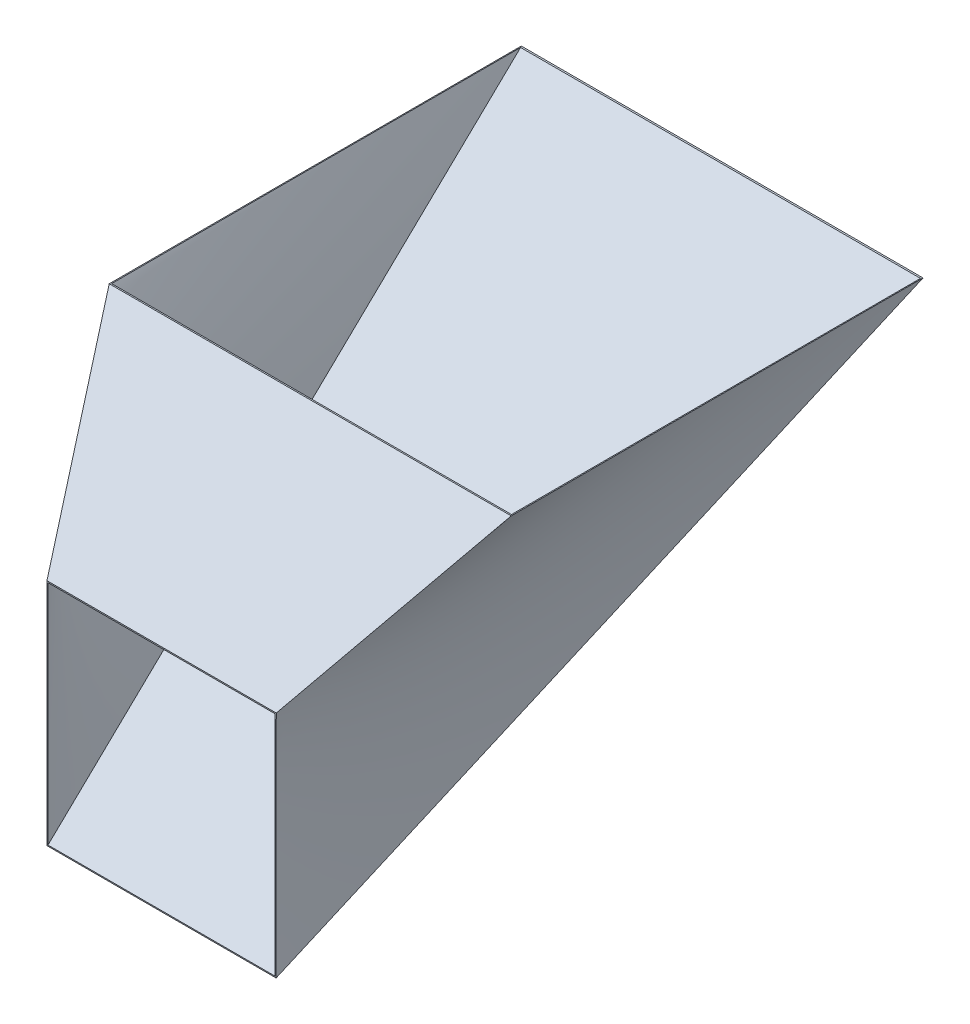
ISO-10303-21;
HEADER;
FILE_DESCRIPTION(('STEP AP214'),'2;1');
FILE_NAME('part.step','',(''),(''),'','','');
FILE_SCHEMA(('AUTOMOTIVE_DESIGN { 1 0 10303 214 1 1 1 1 }'));
ENDSEC;
DATA;
#1=APPLICATION_CONTEXT('core data for automotive mechanical design processes');
#2=APPLICATION_PROTOCOL_DEFINITION('international standard','automotive_design',2000,#1);
#3=PRODUCT_CONTEXT('',#1,'mechanical');
#4=PRODUCT('Part','Part','',(#3));
#5=PRODUCT_RELATED_PRODUCT_CATEGORY('part','',(#4));
#6=PRODUCT_DEFINITION_FORMATION('','',#4);
#7=PRODUCT_DEFINITION_CONTEXT('part definition',#1,'design');
#8=PRODUCT_DEFINITION('design','',#6,#7);
#9=PRODUCT_DEFINITION_SHAPE('','',#8);
#10=(LENGTH_UNIT() NAMED_UNIT(*) SI_UNIT(.MILLI.,.METRE.));
#11=(NAMED_UNIT(*) PLANE_ANGLE_UNIT() SI_UNIT($,.RADIAN.));
#12=(NAMED_UNIT(*) SI_UNIT($,.STERADIAN.) SOLID_ANGLE_UNIT());
#13=UNCERTAINTY_MEASURE_WITH_UNIT(LENGTH_MEASURE(1.E-05),#10,'distance_accuracy_value','');
#14=(GEOMETRIC_REPRESENTATION_CONTEXT(3) GLOBAL_UNCERTAINTY_ASSIGNED_CONTEXT((#13)) GLOBAL_UNIT_ASSIGNED_CONTEXT((#10,
#11,#12)) REPRESENTATION_CONTEXT('',''));
#15=CARTESIAN_POINT('',(0.,0.,0.));
#16=DIRECTION('',(0.,0.,1.));
#17=DIRECTION('',(1.,0.,0.));
#18=AXIS2_PLACEMENT_3D('',#15,#16,#17);
#19=CARTESIAN_POINT('',(0.,0.,0.));
#20=DIRECTION('',(0.,1.,0.));
#21=DIRECTION('',(0.,0.,1.));
#22=AXIS2_PLACEMENT_3D('',#19,#20,#21);
#23=PLANE('',#22);
#24=DIRECTION('',(0.,0.,-1.));
#25=VECTOR('',#24,1.);
#26=CARTESIAN_POINT('',(220.,0.,-225.));
#27=LINE('',#26,#25);
#28=CARTESIAN_POINT('',(220.,0.,225.));
#29=VERTEX_POINT('',#28);
#30=CARTESIAN_POINT('',(220.,0.,-225.));
#31=VERTEX_POINT('',#30);
#32=EDGE_CURVE('E133',#29,#31,#27,.T.);
#33=ORIENTED_EDGE('',*,*,#32,.F.);
#34=DIRECTION('',(1.,0.,0.));
#35=VECTOR('',#34,1.);
#36=CARTESIAN_POINT('',(-220.,0.,225.));
#37=LINE('',#36,#35);
#38=CARTESIAN_POINT('',(-220.,0.,225.));
#39=VERTEX_POINT('',#38);
#40=EDGE_CURVE('E159',#39,#29,#37,.T.);
#41=ORIENTED_EDGE('',*,*,#40,.F.);
#42=DIRECTION('',(0.,0.,1.));
#43=VECTOR('',#42,1.);
#44=CARTESIAN_POINT('',(-220.,0.,-225.));
#45=LINE('',#44,#43);
#46=CARTESIAN_POINT('',(-220.,0.,-225.));
#47=VERTEX_POINT('',#46);
#48=EDGE_CURVE('E145',#47,#39,#45,.T.);
#49=ORIENTED_EDGE('',*,*,#48,.F.);
#50=DIRECTION('',(-1.,0.,0.));
#51=VECTOR('',#50,1.);
#52=CARTESIAN_POINT('',(-220.,0.,-225.));
#53=LINE('',#52,#51);
#54=EDGE_CURVE('E155',#31,#47,#53,.T.);
#55=ORIENTED_EDGE('',*,*,#54,.F.);
#56=EDGE_LOOP('',(#33,#41,#49,#55));
#57=FACE_BOUND('',#56,.T.);
#58=CARTESIAN_POINT('',(221.175220665333,0.,226.460545990022));
#59=CARTESIAN_POINT('',(221.165519850105,0.,218.145964198324));
#60=CARTESIAN_POINT('',(221.156939692717,0.,209.831381216536));
#61=CARTESIAN_POINT('',(221.141545897358,0.,193.202213742846));
#62=CARTESIAN_POINT('',(221.134732259357,0.,184.887629250944));
#63=CARTESIAN_POINT('',(221.12239670645,0.,168.258459663972));
#64=CARTESIAN_POINT('',(221.116874791495,0.,159.943874568903));
#65=CARTESIAN_POINT('',(221.106828687238,0.,143.314703741531));
#66=CARTESIAN_POINT('',(221.102304497941,0.,135.000118009228));
#67=CARTESIAN_POINT('',(221.089876508193,0.,110.056361146522));
#68=CARTESIAN_POINT('',(221.083117285272,0.,93.4271894532348));
#69=CARTESIAN_POINT('',(221.071498520779,0.,60.1688452775092));
#70=CARTESIAN_POINT('',(221.066638979227,0.,43.5396727950706));
#71=CARTESIAN_POINT('',(221.059722848361,0.,16.3384707536719));
#72=CARTESIAN_POINT('',(221.057290036794,0.,5.76644128771332));
#73=CARTESIAN_POINT('',(221.052827135619,0.,-15.3776176912375));
#74=CARTESIAN_POINT('',(221.050797046009,0.,-25.9496472042298));
#75=CARTESIAN_POINT('',(221.045180429828,0.,-57.6657360915291));
#76=CARTESIAN_POINT('',(221.042067555968,0.,-78.8097955490056));
#77=CARTESIAN_POINT('',(221.036653963626,0.,-121.097914798088));
#78=CARTESIAN_POINT('',(221.034353245154,0.,-142.241974589693));
#79=CARTESIAN_POINT('',(221.030324448454,0.,-184.530093916415));
#80=CARTESIAN_POINT('',(221.028596370217,0.,-205.674153451531));
#81=CARTESIAN_POINT('',(221.027034854479,0.,-226.818212993872));
#82=B_SPLINE_CURVE_WITH_KNOTS('',3,(#58,#59,#60,#61,#62,#63,#64,#65,#66,#67,#68,#69,#70,#71,#72,
#73,#74,#75,#76,#77,#78,#79,#80,#81),.UNSPECIFIED.,.F.,.F.,(4,2,2,2,2,2,2,2,2,2,2,4),(0.,
24.9437621087512,49.8875237915527,74.8312845118024,99.7750453549201,149.662564349903,
199.550083870565,231.266173099604,262.982262217359,326.414441248327,389.846620991211,
453.278799797717),.UNSPECIFIED.);
#83=CARTESIAN_POINT('',(221.175220665333,0.,226.460545990022));
#84=VERTEX_POINT('',#83);
#85=CARTESIAN_POINT('',(221.027034854479,0.,-226.818212993872));
#86=VERTEX_POINT('',#85);
#87=EDGE_CURVE('E307',#84,#86,#82,.T.);
#88=ORIENTED_EDGE('',*,*,#87,.T.);
#89=DIRECTION('',(-1.,0.,0.));
#90=VECTOR('',#89,1.);
#91=CARTESIAN_POINT('',(0.,0.,-226.818212993872));
#92=LINE('',#91,#90);
#93=CARTESIAN_POINT('',(-221.027034854479,0.,-226.818212993872));
#94=VERTEX_POINT('',#93);
#95=EDGE_CURVE('E12',#86,#94,#92,.T.);
#96=ORIENTED_EDGE('',*,*,#95,.T.);
#97=CARTESIAN_POINT('',(-221.027034854479,0.,-226.818212993872));
#98=CARTESIAN_POINT('',(-221.028240846582,0.,-210.389438541998));
#99=CARTESIAN_POINT('',(-221.029555819118,0.,-193.960664096186));
#100=CARTESIAN_POINT('',(-221.032502368467,0.,-161.103115224358));
#101=CARTESIAN_POINT('',(-221.03413394528,0.,-144.674340798344));
#102=CARTESIAN_POINT('',(-221.037812346687,0.,-111.816791182955));
#103=CARTESIAN_POINT('',(-221.039859171301,0.,-95.3880159935802));
#104=CARTESIAN_POINT('',(-221.044524299747,0.,-62.5304656937369));
#105=CARTESIAN_POINT('',(-221.047142603579,0.,-46.1016905832682));
#106=CARTESIAN_POINT('',(-221.054080403817,0.,-8.3284588431294));
#107=CARTESIAN_POINT('',(-221.058674506377,0.,13.0159977372503));
#108=CARTESIAN_POINT('',(-221.070024072017,0.,55.704909873736));
#109=CARTESIAN_POINT('',(-221.076779535045,0.,77.0493654298421));
#110=CARTESIAN_POINT('',(-221.089771075777,0.,109.066049088818));
#111=CARTESIAN_POINT('',(-221.094577980813,0.,119.738277759006));
#112=CARTESIAN_POINT('',(-221.105508470598,0.,141.082734360696));
#113=CARTESIAN_POINT('',(-221.111632055337,0.,151.754962292198));
#114=CARTESIAN_POINT('',(-221.125702708779,0.,173.099417519189));
#115=CARTESIAN_POINT('',(-221.13364977757,0.,183.771644814678));
#116=CARTESIAN_POINT('',(-221.147537165977,0.,199.779984193446));
#117=CARTESIAN_POINT('',(-221.152494093056,0.,205.11609712402));
#118=CARTESIAN_POINT('',(-221.163214612592,0.,215.7883222103));
#119=CARTESIAN_POINT('',(-221.168978205056,0.,221.124434366006));
#120=CARTESIAN_POINT('',(-221.175220665332,0.,226.460545990022));
#121=B_SPLINE_CURVE_WITH_KNOTS('',3,(#97,#98,#99,#100,#101,#102,#103,#104,#105,#106,#107,#108,
#109,#110,#111,#112,#113,#114,#115,#116,#117,#118,#119,#120),.UNSPECIFIED.,.F.,.F.,(4,2,2,2,2,2,
2,2,2,2,2,4),(0.,49.2863234909943,98.5726470087193,147.858972952417,197.145298895696,
261.178670073862,325.212039715283,357.228728914357,389.245417881581,421.262108389765,
437.270454034231,453.278799796461),.UNSPECIFIED.);
#122=CARTESIAN_POINT('',(-221.175220665332,0.,226.460545990022));
#123=VERTEX_POINT('',#122);
#124=EDGE_CURVE('E57',#94,#123,#121,.T.);
#125=ORIENTED_EDGE('',*,*,#124,.T.);
#126=DIRECTION('',(1.,0.,0.));
#127=VECTOR('',#126,1.);
#128=CARTESIAN_POINT('',(0.,0.,226.460545990022));
#129=LINE('',#128,#127);
#130=EDGE_CURVE('E345',#123,#84,#129,.T.);
#131=ORIENTED_EDGE('',*,*,#130,.T.);
#132=EDGE_LOOP('',(#88,#96,#125,#131));
#133=FACE_BOUND('',#132,.T.);
#134=ADVANCED_FACE('F45',(#57,#133),#23,.T.);
#135=CARTESIAN_POINT('',(0.,0.,390.));
#136=DIRECTION('',(0.,0.,1.));
#137=DIRECTION('',(1.,0.,0.));
#138=AXIS2_PLACEMENT_3D('',#135,#136,#137);
#139=PLANE('',#138);
#140=DIRECTION('',(0.,1.,0.));
#141=VECTOR('',#140,1.);
#142=CARTESIAN_POINT('',(125.,-155.,390.));
#143=LINE('',#142,#141);
#144=CARTESIAN_POINT('',(125.,-405.,390.));
#145=VERTEX_POINT('',#144);
#146=CARTESIAN_POINT('',(125.,-155.,390.));
#147=VERTEX_POINT('',#146);
#148=EDGE_CURVE('E123',#145,#147,#143,.T.);
#149=ORIENTED_EDGE('',*,*,#148,.F.);
#150=DIRECTION('',(1.,0.,0.));
#151=VECTOR('',#150,1.);
#152=CARTESIAN_POINT('',(-125.,-405.,390.));
#153=LINE('',#152,#151);
#154=CARTESIAN_POINT('',(-125.,-405.,390.));
#155=VERTEX_POINT('',#154);
#156=EDGE_CURVE('E112',#155,#145,#153,.T.);
#157=ORIENTED_EDGE('',*,*,#156,.F.);
#158=DIRECTION('',(0.,-1.,0.));
#159=VECTOR('',#158,1.);
#160=CARTESIAN_POINT('',(-125.,-155.,390.));
#161=LINE('',#160,#159);
#162=CARTESIAN_POINT('',(-125.,-155.,390.));
#163=VERTEX_POINT('',#162);
#164=EDGE_CURVE('E122',#163,#155,#161,.T.);
#165=ORIENTED_EDGE('',*,*,#164,.F.);
#166=DIRECTION('',(-1.,0.,0.));
#167=VECTOR('',#166,1.);
#168=CARTESIAN_POINT('',(-125.,-155.,390.));
#169=LINE('',#168,#167);
#170=EDGE_CURVE('E51',#147,#163,#169,.T.);
#171=ORIENTED_EDGE('',*,*,#170,.F.);
#172=EDGE_LOOP('',(#149,#157,#165,#171));
#173=FACE_BOUND('',#172,.T.);
#174=CARTESIAN_POINT('',(126.011771350893,-406.197359776452,390.));
#175=CARTESIAN_POINT('',(126.012499862065,-395.673634675024,390.));
#176=CARTESIAN_POINT('',(126.013306982146,-385.149909574774,390.));
#177=CARTESIAN_POINT('',(126.015214150909,-364.102459889737,390.));
#178=CARTESIAN_POINT('',(126.016314199577,-353.578735304949,390.));
#179=CARTESIAN_POINT('',(126.018942936337,-332.531286166777,390.));
#180=CARTESIAN_POINT('',(126.02047162443,-322.007561613393,390.));
#181=CARTESIAN_POINT('',(126.024211193803,-300.960112128319,390.));
#182=CARTESIAN_POINT('',(126.026422075115,-290.436387196631,390.));
#183=CARTESIAN_POINT('',(126.030616847322,-274.650798846689,390.));
#184=CARTESIAN_POINT('',(126.03216151332,-269.388935313617,390.));
#185=CARTESIAN_POINT('',(126.035649426643,-258.865208419626,390.));
#186=CARTESIAN_POINT('',(126.037592673963,-253.603345058708,390.));
#187=CARTESIAN_POINT('',(126.042023971317,-243.079619181396,390.));
#188=CARTESIAN_POINT('',(126.044512021286,-237.817756665002,390.));
#189=CARTESIAN_POINT('',(126.050254388222,-227.294031871321,390.));
#190=CARTESIAN_POINT('',(126.053508705212,-222.032169594034,390.));
#191=CARTESIAN_POINT('',(126.061130265116,-211.508441177021,390.));
#192=CARTESIAN_POINT('',(126.065497509014,-206.246575037296,390.));
#193=CARTESIAN_POINT('',(126.075897167665,-195.722844731713,390.));
#194=CARTESIAN_POINT('',(126.081929582277,-190.460980565854,390.));
#195=CARTESIAN_POINT('',(126.092959539346,-182.568185981992,390.));
#196=CARTESIAN_POINT('',(126.096966415246,-179.937254195506,390.));
#197=CARTESIAN_POINT('',(126.105837133401,-174.675392143292,390.));
#198=CARTESIAN_POINT('',(126.110700975627,-172.044461877563,390.));
#199=CARTESIAN_POINT('',(126.121530124486,-166.78260278463,390.));
#200=CARTESIAN_POINT('',(126.127495431434,-164.151673957427,390.));
#201=CARTESIAN_POINT('',(126.140915778304,-158.889819822953,390.));
#202=CARTESIAN_POINT('',(126.148370818405,-156.258894515683,390.));
#203=CARTESIAN_POINT('',(126.156764859178,-153.627971948767,390.));
#204=B_SPLINE_CURVE_WITH_KNOTS('',3,(#174,#175,#176,#177,#178,#179,#180,#181,#182,#183,#184,
#185,#186,#187,#188,#189,#190,#191,#192,#193,#194,#195,#196,#197,#198,#199,#200,#201,#202,#203),
.UNSPECIFIED.,.F.,.F.,(4,2,2,2,2,2,2,2,2,2,2,2,2,2,4),(0.,31.5711753864716,63.1423493080752,
94.7135232914352,126.284698736987,142.070290005904,157.855881144523,173.641470422477,
189.427060188047,205.212663906868,220.998266284223,228.891070689022,236.783874819798,
244.676681210093,252.569488549193),.UNSPECIFIED.);
#205=CARTESIAN_POINT('',(126.011771350893,-406.197359776452,390.));
#206=VERTEX_POINT('',#205);
#207=CARTESIAN_POINT('',(126.156764859178,-153.627971948767,390.));
#208=VERTEX_POINT('',#207);
#209=EDGE_CURVE('E157',#206,#208,#204,.T.);
#210=ORIENTED_EDGE('',*,*,#209,.T.);
#211=DIRECTION('',(-1.,0.,0.));
#212=VECTOR('',#211,1.);
#213=CARTESIAN_POINT('',(0.,-153.627971948767,390.));
#214=LINE('',#213,#212);
#215=CARTESIAN_POINT('',(-126.156764859178,-153.627971948767,390.));
#216=VERTEX_POINT('',#215);
#217=EDGE_CURVE('E390',#208,#216,#214,.T.);
#218=ORIENTED_EDGE('',*,*,#217,.T.);
#219=CARTESIAN_POINT('',(-126.156764859178,-153.627971948767,390.));
#220=CARTESIAN_POINT('',(-126.147996853035,-156.377203900606,390.));
#221=CARTESIAN_POINT('',(-126.140249560255,-159.126438812113,390.));
#222=CARTESIAN_POINT('',(-126.126361936906,-164.624912379924,390.));
#223=CARTESIAN_POINT('',(-126.120221606129,-167.374151036228,390.));
#224=CARTESIAN_POINT('',(-126.10911344324,-172.872629135851,390.));
#225=CARTESIAN_POINT('',(-126.104145610492,-175.621868579168,390.));
#226=CARTESIAN_POINT('',(-126.095114104124,-181.120349037657,390.));
#227=CARTESIAN_POINT('',(-126.091050430538,-183.869590052828,390.));
#228=CARTESIAN_POINT('',(-126.07989456737,-192.117314045696,390.));
#229=CARTESIAN_POINT('',(-126.073837534574,-197.615798405158,390.));
#230=CARTESIAN_POINT('',(-126.06343710051,-208.612766641431,390.));
#231=CARTESIAN_POINT('',(-126.059093698626,-214.111250518241,390.));
#232=CARTESIAN_POINT('',(-126.051539331049,-225.108219594566,390.));
#233=CARTESIAN_POINT('',(-126.048328365471,-230.60670479408,390.));
#234=CARTESIAN_POINT('',(-126.042678710398,-241.603675727722,390.));
#235=CARTESIAN_POINT('',(-126.040240020924,-247.102161461851,390.));
#236=CARTESIAN_POINT('',(-126.035551306188,-259.000509675279,390.));
#237=CARTESIAN_POINT('',(-126.033397745414,-265.400372191782,390.));
#238=CARTESIAN_POINT('',(-126.029596804916,-278.200097155827,390.));
#239=CARTESIAN_POINT('',(-126.027949425173,-284.59995960337,390.));
#240=CARTESIAN_POINT('',(-126.02501457211,-297.39968521809,390.));
#241=CARTESIAN_POINT('',(-126.023727098824,-303.799548385267,390.));
#242=CARTESIAN_POINT('',(-126.021416159539,-316.599274826548,390.));
#243=CARTESIAN_POINT('',(-126.020392693543,-322.999138100652,390.));
#244=CARTESIAN_POINT('',(-126.017609292987,-342.198728428876,390.));
#245=CARTESIAN_POINT('',(-126.016136355959,-354.998455523288,390.));
#246=CARTESIAN_POINT('',(-126.013667833568,-380.597908339251,390.));
#247=CARTESIAN_POINT('',(-126.012672248152,-393.397634060803,390.));
#248=CARTESIAN_POINT('',(-126.011771350893,-406.197359776452,390.));
#249=B_SPLINE_CURVE_WITH_KNOTS('',3,(#219,#220,#221,#222,#223,#224,#225,#226,#227,#228,#229,
#230,#231,#232,#233,#234,#235,#236,#237,#238,#239,#240,#241,#242,#243,#244,#245,#246,#247,#248),
.UNSPECIFIED.,.F.,.F.,(4,2,2,2,2,2,2,2,2,2,2,2,2,2,4),(0.,8.24773718793053,16.4954733070543,
24.7432049388292,32.9909368791332,49.4863994565045,65.9818560979391,82.4773144248779,
98.9727732155879,118.172361821351,137.371949787192,156.571539669857,175.771129733686,
214.170311258196,252.569488520666),.UNSPECIFIED.);
#250=CARTESIAN_POINT('',(-126.011771350893,-406.197359776452,390.));
#251=VERTEX_POINT('',#250);
#252=EDGE_CURVE('E392',#216,#251,#249,.T.);
#253=ORIENTED_EDGE('',*,*,#252,.T.);
#254=DIRECTION('',(1.,0.,0.));
#255=VECTOR('',#254,1.);
#256=CARTESIAN_POINT('',(0.,-406.197359776452,390.));
#257=LINE('',#256,#255);
#258=EDGE_CURVE('E389',#251,#206,#257,.T.);
#259=ORIENTED_EDGE('',*,*,#258,.T.);
#260=EDGE_LOOP('',(#210,#218,#253,#259));
#261=FACE_BOUND('',#260,.T.);
#262=ADVANCED_FACE('F138',(#173,#261),#139,.T.);
#263=CARTESIAN_POINT('',(125.,-152.324370724536,390.));
#264=CARTESIAN_POINT('',(220.95,1.52324370724536,228.214294022795));
#265=CARTESIAN_POINT('',(125.,-153.21624714969,390.));
#266=CARTESIAN_POINT('',(220.95,1.5321624714969,226.592862681863));
#267=CARTESIAN_POINT('',(125.,-154.108123574845,390.));
#268=CARTESIAN_POINT('',(220.95,1.54108123574845,224.971431340932));
#269=CARTESIAN_POINT('',(125.,-196.666666666667,390.));
#270=CARTESIAN_POINT('',(220.95,1.96666666666667,147.599999999998));
#271=CARTESIAN_POINT('',(125.,-238.333333333333,390.));
#272=CARTESIAN_POINT('',(220.95,2.38333333333333,71.8499999999973));
#273=CARTESIAN_POINT('',(125.,-321.666666666667,390.));
#274=CARTESIAN_POINT('',(220.95,3.21666666666667,-79.6500000000027));
#275=CARTESIAN_POINT('',(125.,-363.333333333333,390.));
#276=CARTESIAN_POINT('',(220.95,3.63333333333333,-155.400000000002));
#277=CARTESIAN_POINT('',(125.,-405.937371786989,390.));
#278=CARTESIAN_POINT('',(220.95,4.05937371786989,-232.854141908746));
#279=CARTESIAN_POINT('',(125.,-406.874743573978,390.));
#280=CARTESIAN_POINT('',(220.95,4.06874743573978,-234.558283817491));
#281=CARTESIAN_POINT('',(125.,-407.812115360967,390.));
#282=CARTESIAN_POINT('',(220.95,4.07812115360966,-236.262425726237));
#283=B_SPLINE_SURFACE_WITH_KNOTS('',3,1,((#263,#264),(#265,#266),(#267,#268),(#269,#270),(#271,
#272),(#273,#274),(#275,#276),(#277,#278),(#279,#280),(#281,#282)),.UNSPECIFIED.,.F.,.F.,.F.,(4,
2,2,2,4),(2,2),(-0.0107025171018579,0.,0.5,1.,1.01124846144387),(0.,1.01),.UNSPECIFIED.);
#284=OFFSET_SURFACE('',#283,1.,.F.);
#285=ORIENTED_EDGE('',*,*,#209,.F.);
#286=CARTESIAN_POINT('',(126.011771350893,-406.197359776452,390.));
#287=CARTESIAN_POINT('',(131.003198296099,-384.837340018165,357.564414441119));
#288=CARTESIAN_POINT('',(135.995598585166,-363.477389067567,325.128933367989));
#289=CARTESIAN_POINT('',(145.982143200749,-320.757610505583,260.258158514607));
#290=CARTESIAN_POINT('',(150.976287527264,-299.397782894198,227.822864734354));
#291=CARTESIAN_POINT('',(161.389445490044,-254.867958015367,160.203501029463));
#292=CARTESIAN_POINT('',(166.80859529799,-231.697970380354,125.019445731851));
#293=CARTESIAN_POINT('',(177.648487756935,-185.358107810626,54.651506274116));
#294=CARTESIAN_POINT('',(183.069230407935,-162.188232875912,19.4676221139941));
#295=CARTESIAN_POINT('',(193.91211222721,-115.848581734445,-50.8999962860107));
#296=CARTESIAN_POINT('',(199.334251395492,-92.6788055276933,-86.0837305258929));
#297=CARTESIAN_POINT('',(210.17976098886,-46.3393402984903,-156.451066614683));
#298=CARTESIAN_POINT('',(215.603131413944,-23.1696512760389,-191.63466846359));
#299=CARTESIAN_POINT('',(221.027034854479,0.,-226.818212993872));
#300=B_SPLINE_CURVE_WITH_KNOTS('',3,(#286,#287,#288,#289,#290,#291,#292,#293,#294,#295,#296,
#297,#298,#299),.UNSPECIFIED.,.F.,.F.,(4,2,2,2,2,2,4),(0.,117.469519329901,234.939038580512,
362.364308134119,489.789577735075,617.21484796986,744.640118115103),.UNSPECIFIED.);
#301=EDGE_CURVE('E166',#206,#86,#300,.T.);
#302=ORIENTED_EDGE('',*,*,#301,.T.);
#303=ORIENTED_EDGE('',*,*,#87,.F.);
#304=CARTESIAN_POINT('',(221.175220665333,0.,226.460545990022));
#305=CARTESIAN_POINT('',(217.938016401283,-5.24359705221147,232.042439626247));
#306=CARTESIAN_POINT('',(214.700237674991,-10.4870278545109,237.62415628676));
#307=CARTESIAN_POINT('',(208.223502901688,-20.9735485904807,248.787226747631));
#308=CARTESIAN_POINT('',(204.984546854677,-26.2166385241508,254.368580547989));
#309=CARTESIAN_POINT('',(198.505429272971,-36.702468783006,265.530915984835));
#310=CARTESIAN_POINT('',(195.26526773836,-41.9452091082154,271.111897621348));
#311=CARTESIAN_POINT('',(188.78374774845,-52.4303429033294,282.273491661308));
#312=CARTESIAN_POINT('',(185.542389293151,-57.6727363732343,287.854104064756));
#313=CARTESIAN_POINT('',(177.624947150418,-70.4752887257942,301.482627536835));
#314=CARTESIAN_POINT('',(172.948242186133,-78.0352674978731,309.530346874855));
#315=CARTESIAN_POINT('',(163.592827302495,-93.1546435997134,325.625166596169));
#316=CARTESIAN_POINT('',(158.914117383105,-100.714040929464,333.672266979452));
#317=CARTESIAN_POINT('',(149.555481088171,-115.832483043933,349.766092456144));
#318=CARTESIAN_POINT('',(144.875554712561,-123.391527828632,357.812817549533));
#319=CARTESIAN_POINT('',(137.855692958734,-134.730102950742,369.882913647264));
#320=CARTESIAN_POINT('',(135.515743708262,-138.509629263065,373.906280366834));
#321=CARTESIAN_POINT('',(130.836050901456,-146.068741582374,381.953077351904));
#322=CARTESIAN_POINT('',(128.496307345122,-149.84832758936,385.976507617406));
#323=CARTESIAN_POINT('',(126.156764859179,-153.627971948767,390.));
#324=B_SPLINE_CURVE_WITH_KNOTS('',3,(#304,#305,#306,#307,#308,#309,#310,#311,#312,#313,#314,
#315,#316,#317,#318,#319,#320,#321,#322,#323),.UNSPECIFIED.,.F.,.F.,(4,2,2,2,2,2,2,2,2,4),(0.,
24.9437575710542,49.8875151507315,74.8312709823408,99.7750267912939,135.748846368566,
171.72266660471,207.696488783019,225.683399371926,243.670309963432),.UNSPECIFIED.);
#325=EDGE_CURVE('E175',#84,#208,#324,.T.);
#326=ORIENTED_EDGE('',*,*,#325,.T.);
#327=EDGE_LOOP('',(#285,#302,#303,#326));
#328=FACE_BOUND('',#327,.T.);
#329=ADVANCED_FACE('F184',(#328),#284,.T.);
#330=CARTESIAN_POINT('',(0.,-104.185793271459,-68.6101565446193));
#331=DIRECTION('',(0.,0.835170864819878,0.54999056951553));
#332=DIRECTION('',(0.,-0.54999056951553,0.835170864819878));
#333=AXIS2_PLACEMENT_3D('',#330,#331,#332);
#334=PLANE('',#333);
#335=CARTESIAN_POINT('',(-126.011771350893,-406.197359776452,390.));
#336=CARTESIAN_POINT('',(-131.003198296099,-384.837340018165,357.56441444112));
#337=CARTESIAN_POINT('',(-135.995598585165,-363.477389067569,325.128933367992));
#338=CARTESIAN_POINT('',(-145.982143200748,-320.757610505587,260.258158514612));
#339=CARTESIAN_POINT('',(-150.976287527263,-299.397782894201,227.82286473436));
#340=CARTESIAN_POINT('',(-161.389445490043,-254.867958015371,160.20350102947));
#341=CARTESIAN_POINT('',(-166.808595297989,-231.697970380357,125.019445731856));
#342=CARTESIAN_POINT('',(-177.648487756934,-185.358107810629,54.6515062741206));
#343=CARTESIAN_POINT('',(-183.069230407934,-162.188232875914,19.4676221139982));
#344=CARTESIAN_POINT('',(-193.912112227209,-115.848581734447,-50.8999962860078));
#345=CARTESIAN_POINT('',(-199.334251395492,-92.6788055276949,-86.0837305258905));
#346=CARTESIAN_POINT('',(-210.179760988859,-46.3393402984911,-156.451066614681));
#347=CARTESIAN_POINT('',(-215.603131413944,-23.1696512760393,-191.63466846359));
#348=CARTESIAN_POINT('',(-221.027034854479,0.,-226.818212993872));
#349=B_SPLINE_CURVE_WITH_KNOTS('',3,(#335,#336,#337,#338,#339,#340,#341,#342,#343,#344,#345,
#346,#347,#348),.UNSPECIFIED.,.F.,.F.,(4,2,2,2,2,2,4),(0.,117.469519329897,234.939038580504,
362.364308134113,489.78957773507,617.214847969857,744.640118115103),.UNSPECIFIED.);
#350=EDGE_CURVE('E174',#251,#94,#349,.T.);
#351=ORIENTED_EDGE('',*,*,#350,.T.);
#352=ORIENTED_EDGE('',*,*,#95,.F.);
#353=ORIENTED_EDGE('',*,*,#301,.F.);
#354=ORIENTED_EDGE('',*,*,#258,.F.);
#355=EDGE_LOOP('',(#351,#352,#353,#354));
#356=FACE_BOUND('',#355,.T.);
#357=ADVANCED_FACE('F181',(#356),#334,.F.);
#358=CARTESIAN_POINT('',(0.,113.009335876972,106.160285217762));
#359=DIRECTION('',(0.,-0.728848072093987,-0.684675461664049));
#360=DIRECTION('',(0.,0.684675461664049,-0.728848072093987));
#361=AXIS2_PLACEMENT_3D('',#358,#359,#360);
#362=PLANE('',#361);
#363=ORIENTED_EDGE('',*,*,#325,.F.);
#364=ORIENTED_EDGE('',*,*,#130,.F.);
#365=CARTESIAN_POINT('',(-126.156764859178,-153.627971948767,390.));
#366=CARTESIAN_POINT('',(-129.375092691832,-148.428623743758,384.465209975313));
#367=CARTESIAN_POINT('',(-132.593786814821,-143.229381843182,378.930533113409));
#368=CARTESIAN_POINT('',(-139.031429033653,-132.830971717709,367.861257818551));
#369=CARTESIAN_POINT('',(-142.250377129497,-127.631803492813,362.326659385597));
#370=CARTESIAN_POINT('',(-148.688048776832,-117.233401639144,351.257392896208));
#371=CARTESIAN_POINT('',(-151.906772328313,-112.03416801037,345.722724839771));
#372=CARTESIAN_POINT('',(-158.343626049374,-101.635528577006,334.653205442964));
#373=CARTESIAN_POINT('',(-161.561756218954,-96.4361227724173,329.118354102595));
#374=CARTESIAN_POINT('',(-169.483716344567,-83.6348807756669,315.491225525409));
#375=CARTESIAN_POINT('',(-174.187050812803,-76.0329008326259,307.398795263463));
#376=CARTESIAN_POINT('',(-183.591361079803,-60.8282571984653,291.213206878711));
#377=CARTESIAN_POINT('',(-188.292336878608,-53.2255935073582,283.12004875592));
#378=CARTESIAN_POINT('',(-197.691751708218,-38.0195294684363,266.93294832739));
#379=CARTESIAN_POINT('',(-202.390190738576,-30.4161291204924,258.839006021514));
#380=CARTESIAN_POINT('',(-211.78457009341,-15.2086045092356,242.650350790176));
#381=CARTESIAN_POINT('',(-216.480510417797,-7.60448024589688,234.555637864687));
#382=CARTESIAN_POINT('',(-221.175220665332,0.,226.460545990022));
#383=B_SPLINE_CURVE_WITH_KNOTS('',3,(#365,#366,#367,#368,#369,#370,#371,#372,#373,#374,#375,
#376,#377,#378,#379,#380,#381,#382),.UNSPECIFIED.,.F.,.F.,(4,2,2,2,2,2,2,2,4),(0.,
24.7431365386667,49.4862732004607,74.2294108050709,98.9725483434882,135.146985710245,
171.321422423199,207.495865495321,243.670309864456),.UNSPECIFIED.);
#384=EDGE_CURVE('E366',#216,#123,#383,.T.);
#385=ORIENTED_EDGE('',*,*,#384,.F.);
#386=ORIENTED_EDGE('',*,*,#217,.F.);
#387=EDGE_LOOP('',(#363,#364,#385,#386));
#388=FACE_BOUND('',#387,.T.);
#389=ADVANCED_FACE('F189',(#388),#362,.F.);
#390=CARTESIAN_POINT('',(-125.,-407.812101307226,390.));
#391=CARTESIAN_POINT('',(-220.95,4.07812101307226,-236.262400176537));
#392=CARTESIAN_POINT('',(-125.,-406.874734204817,390.));
#393=CARTESIAN_POINT('',(-220.95,4.06874734204817,-234.558266784358));
#394=CARTESIAN_POINT('',(-125.,-405.937367102409,390.));
#395=CARTESIAN_POINT('',(-220.95,4.05937367102409,-232.854133392179));
#396=CARTESIAN_POINT('',(-125.,-363.333333333333,390.));
#397=CARTESIAN_POINT('',(-220.95,3.63333333333333,-155.399999999999));
#398=CARTESIAN_POINT('',(-125.,-321.666666666666,390.));
#399=CARTESIAN_POINT('',(-220.95,3.21666666666666,-79.6499999999982));
#400=CARTESIAN_POINT('',(-125.,-238.333333333333,390.));
#401=CARTESIAN_POINT('',(-220.95,2.38333333333333,71.8500000000018));
#402=CARTESIAN_POINT('',(-125.,-196.666666666667,390.));
#403=CARTESIAN_POINT('',(-220.95,1.96666666666667,147.600000000001));
#404=CARTESIAN_POINT('',(-125.,-154.108909022781,390.));
#405=CARTESIAN_POINT('',(-220.95,1.54108909022781,224.970003396584));
#406=CARTESIAN_POINT('',(-125.,-153.217818045562,390.));
#407=CARTESIAN_POINT('',(-220.95,1.53217818045562,226.590006793168));
#408=CARTESIAN_POINT('',(-125.,-152.326727068343,390.));
#409=CARTESIAN_POINT('',(-220.95,1.52326727068343,228.210010189752));
#410=B_SPLINE_SURFACE_WITH_KNOTS('',3,1,((#390,#391),(#392,#393),(#394,#395),(#396,#397),(#398,
#399),(#400,#401),(#402,#403),(#404,#405),(#406,#407),(#408,#409)),.UNSPECIFIED.,.F.,.F.,.F.,(4,
2,2,2,4),(2,2),(-0.011248405228904,0.,0.5,1.,1.01069309172663),(0.,1.01),.UNSPECIFIED.);
#411=OFFSET_SURFACE('',#410,1.,.F.);
#412=ORIENTED_EDGE('',*,*,#252,.F.);
#413=ORIENTED_EDGE('',*,*,#384,.T.);
#414=ORIENTED_EDGE('',*,*,#124,.F.);
#415=ORIENTED_EDGE('',*,*,#350,.F.);
#416=EDGE_LOOP('',(#412,#413,#414,#415));
#417=FACE_BOUND('',#416,.T.);
#418=ADVANCED_FACE('F47',(#417),#411,.T.);
#419=CARTESIAN_POINT('',(125.,-152.324370724536,390.));
#420=CARTESIAN_POINT('',(220.,0.,229.816132695836));
#421=CARTESIAN_POINT('',(220.95,1.52324370724536,228.214294022795));
#422=CARTESIAN_POINT('',(125.,-153.21624714969,390.));
#423=CARTESIAN_POINT('',(220.,0.,228.210755130557));
#424=CARTESIAN_POINT('',(220.95,1.5321624714969,226.592862681863));
#425=CARTESIAN_POINT('',(125.,-154.108123574845,390.));
#426=CARTESIAN_POINT('',(220.,0.,226.605377565279));
#427=CARTESIAN_POINT('',(220.95,1.54108123574845,224.971431340932));
#428=CARTESIAN_POINT('',(125.,-155.,390.));
#429=CARTESIAN_POINT('',(220.,0.,225.));
#430=CARTESIAN_POINT('',(220.95,1.55,223.35));
#431=CARTESIAN_POINT('',(125.,-196.666666666667,390.));
#432=CARTESIAN_POINT('',(220.,0.,149.999999999998));
#433=CARTESIAN_POINT('',(220.95,1.96666666666667,147.599999999998));
#434=CARTESIAN_POINT('',(125.,-238.333333333333,390.));
#435=CARTESIAN_POINT('',(220.,0.,74.9999999999973));
#436=CARTESIAN_POINT('',(220.95,2.38333333333333,71.8499999999973));
#437=CARTESIAN_POINT('',(125.,-321.666666666667,390.));
#438=CARTESIAN_POINT('',(220.,0.,-75.0000000000026));
#439=CARTESIAN_POINT('',(220.95,3.21666666666667,-79.6500000000027));
#440=CARTESIAN_POINT('',(125.,-363.333333333333,390.));
#441=CARTESIAN_POINT('',(220.,0.,-150.000000000002));
#442=CARTESIAN_POINT('',(220.95,3.63333333333333,-155.400000000002));
#443=CARTESIAN_POINT('',(125.,-405.,390.));
#444=CARTESIAN_POINT('',(220.,0.,-225.));
#445=CARTESIAN_POINT('',(220.95,4.05,-231.15));
#446=CARTESIAN_POINT('',(125.,-405.937371786989,390.));
#447=CARTESIAN_POINT('',(220.,0.,-226.68726921658));
#448=CARTESIAN_POINT('',(220.95,4.05937371786989,-232.854141908746));
#449=CARTESIAN_POINT('',(125.,-406.874743573978,390.));
#450=CARTESIAN_POINT('',(220.,0.,-228.37453843316));
#451=CARTESIAN_POINT('',(220.95,4.06874743573978,-234.558283817491));
#452=CARTESIAN_POINT('',(125.,-407.812115360967,390.));
#453=CARTESIAN_POINT('',(220.,0.,-230.061807649739));
#454=CARTESIAN_POINT('',(220.95,4.07812115360966,-236.262425726237));
#455=B_SPLINE_SURFACE_WITH_KNOTS('',3,1,((#419,#420,#421),(#422,#423,#424),(#425,#426,#427),
(#428,#429,#430),(#431,#432,#433),(#434,#435,#436),(#437,#438,#439),(#440,#441,#442),(#443,#444,
#445),(#446,#447,#448),(#449,#450,#451),(#452,#453,#454)),.UNSPECIFIED.,.F.,.F.,.F.,(4,3,2,3,4),
(2,1,2),(-0.0107025171018579,0.,0.5,1.,1.01124846144387),(0.,1.,1.01),.UNSPECIFIED.);
#456=DIRECTION('',(-0.386950128986524,-0.631339684135908,0.672071276660805));
#457=VECTOR('',#456,1.);
#458=CARTESIAN_POINT('',(172.5,-77.5,307.5));
#459=LINE('',#458,#457);
#460=EDGE_CURVE('E136',#29,#147,#459,.T.);
#461=DIRECTION('',(0.127949754321201,0.545470005264068,-0.828306304289881));
#462=VECTOR('',#461,1.);
#463=CARTESIAN_POINT('',(172.5,-202.5,82.5));
#464=LINE('',#463,#462);
#465=EDGE_CURVE('E116',#145,#31,#464,.T.);
#466=ORIENTED_EDGE('',*,*,#148,.T.);
#467=ORIENTED_EDGE('',*,*,#460,.F.);
#468=ORIENTED_EDGE('',*,*,#32,.T.);
#469=ORIENTED_EDGE('',*,*,#465,.F.);
#470=EDGE_LOOP('',(#466,#467,#468,#469));
#471=FACE_BOUND('',#470,.T.);
#472=ADVANCED_FACE('F129',(#471),#455,.F.);
#473=CARTESIAN_POINT('',(0.,-103.350622406639,-68.0601659751037));
#474=DIRECTION('',(0.,0.835170864819878,0.54999056951553));
#475=DIRECTION('',(0.,-0.54999056951553,0.835170864819878));
#476=AXIS2_PLACEMENT_3D('',#473,#474,#475);
#477=PLANE('',#476);
#478=DIRECTION('',(-0.127949754321201,0.545470005264068,-0.828306304289881));
#479=VECTOR('',#478,1.);
#480=CARTESIAN_POINT('',(-125.,-405.,390.));
#481=LINE('',#480,#479);
#482=EDGE_CURVE('E73',#155,#47,#481,.T.);
#483=ORIENTED_EDGE('',*,*,#482,.F.);
#484=ORIENTED_EDGE('',*,*,#156,.T.);
#485=ORIENTED_EDGE('',*,*,#465,.T.);
#486=ORIENTED_EDGE('',*,*,#54,.T.);
#487=EDGE_LOOP('',(#483,#484,#485,#486));
#488=FACE_BOUND('',#487,.T.);
#489=ADVANCED_FACE('F115',(#488),#477,.T.);
#490=CARTESIAN_POINT('',(0.,112.280487804878,105.475609756098));
#491=DIRECTION('',(0.,-0.728848072093987,-0.684675461664049));
#492=DIRECTION('',(0.,0.684675461664049,-0.728848072093987));
#493=AXIS2_PLACEMENT_3D('',#490,#491,#492);
#494=PLANE('',#493);
#495=ORIENTED_EDGE('',*,*,#460,.T.);
#496=ORIENTED_EDGE('',*,*,#170,.T.);
#497=DIRECTION('',(-0.386950128986524,0.631339684135908,-0.672071276660805));
#498=VECTOR('',#497,1.);
#499=CARTESIAN_POINT('',(-172.5,-77.5,307.5));
#500=LINE('',#499,#498);
#501=EDGE_CURVE('E65',#163,#39,#500,.T.);
#502=ORIENTED_EDGE('',*,*,#501,.T.);
#503=ORIENTED_EDGE('',*,*,#40,.T.);
#504=EDGE_LOOP('',(#495,#496,#502,#503));
#505=FACE_BOUND('',#504,.T.);
#506=ADVANCED_FACE('F224',(#505),#494,.T.);
#507=CARTESIAN_POINT('',(-125.,-407.812101307226,390.));
#508=CARTESIAN_POINT('',(-220.,0.,-230.061782353007));
#509=CARTESIAN_POINT('',(-220.95,4.07812101307226,-236.262400176537));
#510=CARTESIAN_POINT('',(-125.,-406.874734204817,390.));
#511=CARTESIAN_POINT('',(-220.,0.,-228.374521568671));
#512=CARTESIAN_POINT('',(-220.95,4.06874734204817,-234.558266784358));
#513=CARTESIAN_POINT('',(-125.,-405.937367102409,390.));
#514=CARTESIAN_POINT('',(-220.,0.,-226.687260784336));
#515=CARTESIAN_POINT('',(-220.95,4.05937367102409,-232.854133392179));
#516=CARTESIAN_POINT('',(-125.,-405.,390.));
#517=CARTESIAN_POINT('',(-220.,0.,-225.));
#518=CARTESIAN_POINT('',(-220.95,4.05,-231.15));
#519=CARTESIAN_POINT('',(-125.,-363.333333333333,390.));
#520=CARTESIAN_POINT('',(-220.,0.,-149.999999999999));
#521=CARTESIAN_POINT('',(-220.95,3.63333333333333,-155.399999999999));
#522=CARTESIAN_POINT('',(-125.,-321.666666666666,390.));
#523=CARTESIAN_POINT('',(-220.,0.,-74.9999999999983));
#524=CARTESIAN_POINT('',(-220.95,3.21666666666666,-79.6499999999982));
#525=CARTESIAN_POINT('',(-125.,-238.333333333333,390.));
#526=CARTESIAN_POINT('',(-220.,0.,75.0000000000017));
#527=CARTESIAN_POINT('',(-220.95,2.38333333333333,71.8500000000018));
#528=CARTESIAN_POINT('',(-125.,-196.666666666667,390.));
#529=CARTESIAN_POINT('',(-220.,0.,150.000000000001));
#530=CARTESIAN_POINT('',(-220.95,1.96666666666667,147.600000000001));
#531=CARTESIAN_POINT('',(-125.,-155.,390.));
#532=CARTESIAN_POINT('',(-220.,0.,225.));
#533=CARTESIAN_POINT('',(-220.95,1.55,223.35));
#534=CARTESIAN_POINT('',(-125.,-154.108909022781,390.));
#535=CARTESIAN_POINT('',(-220.,0.,226.603963758994));
#536=CARTESIAN_POINT('',(-220.95,1.54108909022781,224.970003396584));
#537=CARTESIAN_POINT('',(-125.,-153.217818045562,390.));
#538=CARTESIAN_POINT('',(-220.,0.,228.207927517988));
#539=CARTESIAN_POINT('',(-220.95,1.53217818045562,226.590006793168));
#540=CARTESIAN_POINT('',(-125.,-152.326727068343,390.));
#541=CARTESIAN_POINT('',(-220.,0.,229.811891276982));
#542=CARTESIAN_POINT('',(-220.95,1.52326727068343,228.210010189752));
#543=B_SPLINE_SURFACE_WITH_KNOTS('',3,1,((#507,#508,#509),(#510,#511,#512),(#513,#514,#515),
(#516,#517,#518),(#519,#520,#521),(#522,#523,#524),(#525,#526,#527),(#528,#529,#530),(#531,#532,
#533),(#534,#535,#536),(#537,#538,#539),(#540,#541,#542)),.UNSPECIFIED.,.F.,.F.,.F.,(4,3,2,3,4),
(2,1,2),(-0.011248405228904,0.,0.5,1.,1.01069309172663),(0.,1.,1.01),.UNSPECIFIED.);
#544=ORIENTED_EDGE('',*,*,#164,.T.);
#545=ORIENTED_EDGE('',*,*,#482,.T.);
#546=ORIENTED_EDGE('',*,*,#48,.T.);
#547=ORIENTED_EDGE('',*,*,#501,.F.);
#548=EDGE_LOOP('',(#544,#545,#546,#547));
#549=FACE_BOUND('',#548,.T.);
#550=ADVANCED_FACE('F200',(#549),#543,.F.);
#551=CLOSED_SHELL('',(#134,#262,#329,#357,#389,#418,#472,#489,#506,#550));
#552=MANIFOLD_SOLID_BREP('B2',#551);
#553=ADVANCED_BREP_SHAPE_REPRESENTATION('',(#18,#552),#14);
#554=SHAPE_DEFINITION_REPRESENTATION(#9,#553);
ENDSEC;
END-ISO-10303-21;
